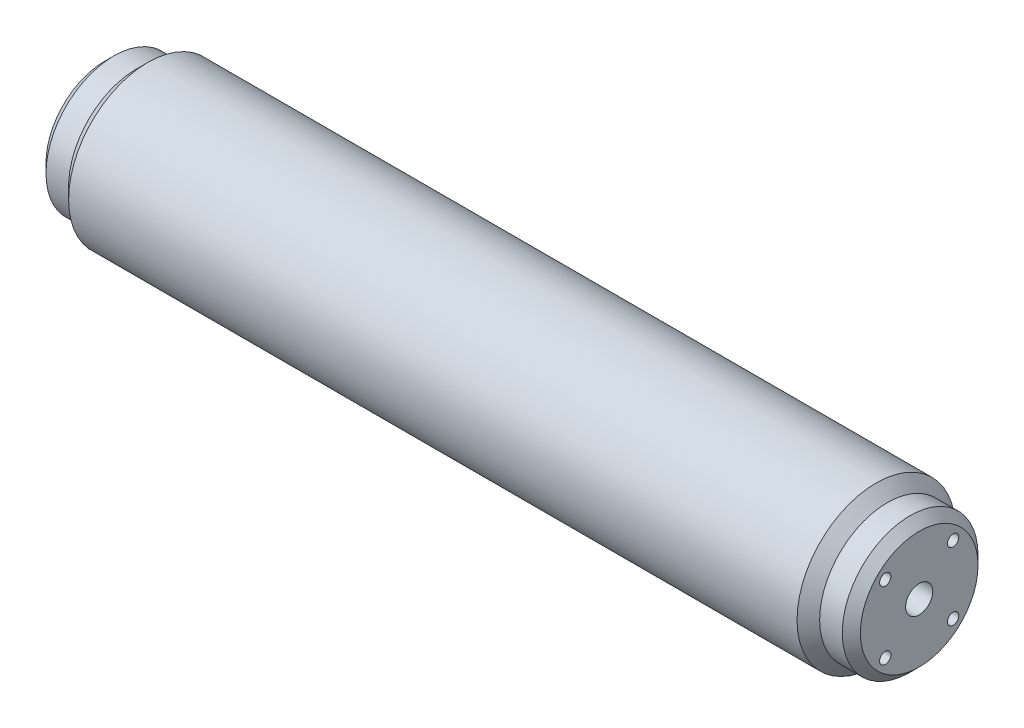
ISO-10303-21;
HEADER;
FILE_DESCRIPTION(('STEP AP214'),'2;1');
FILE_NAME('part.step','',(''),(''),'','','');
FILE_SCHEMA(('AUTOMOTIVE_DESIGN { 1 0 10303 214 1 1 1 1 }'));
ENDSEC;
DATA;
#1=APPLICATION_CONTEXT('core data for automotive mechanical design processes');
#2=APPLICATION_PROTOCOL_DEFINITION('international standard','automotive_design',2000,#1);
#3=PRODUCT_CONTEXT('',#1,'mechanical');
#4=PRODUCT('Part','Part','',(#3));
#5=PRODUCT_RELATED_PRODUCT_CATEGORY('part','',(#4));
#6=PRODUCT_DEFINITION_FORMATION('','',#4);
#7=PRODUCT_DEFINITION_CONTEXT('part definition',#1,'design');
#8=PRODUCT_DEFINITION('design','',#6,#7);
#9=PRODUCT_DEFINITION_SHAPE('','',#8);
#10=(LENGTH_UNIT() NAMED_UNIT(*) SI_UNIT(.MILLI.,.METRE.));
#11=(NAMED_UNIT(*) PLANE_ANGLE_UNIT() SI_UNIT($,.RADIAN.));
#12=(NAMED_UNIT(*) SI_UNIT($,.STERADIAN.) SOLID_ANGLE_UNIT());
#13=UNCERTAINTY_MEASURE_WITH_UNIT(LENGTH_MEASURE(1.E-05),#10,'distance_accuracy_value','');
#14=(GEOMETRIC_REPRESENTATION_CONTEXT(3) GLOBAL_UNCERTAINTY_ASSIGNED_CONTEXT((#13)) GLOBAL_UNIT_ASSIGNED_CONTEXT((#10,
#11,#12)) REPRESENTATION_CONTEXT('',''));
#15=CARTESIAN_POINT('',(0.,0.,0.));
#16=DIRECTION('',(0.,0.,1.));
#17=DIRECTION('',(1.,0.,0.));
#18=AXIS2_PLACEMENT_3D('',#15,#16,#17);
#19=CARTESIAN_POINT('',(80.,0.,0.));
#20=DIRECTION('',(-1.,0.,0.));
#21=DIRECTION('',(0.,0.,1.));
#22=AXIS2_PLACEMENT_3D('',#19,#20,#21);
#23=CYLINDRICAL_SURFACE('',#22,17.5);
#24=CARTESIAN_POINT('',(-80.5,0.,0.));
#25=DIRECTION('',(1.,0.,0.));
#26=DIRECTION('',(0.,0.,-1.));
#27=AXIS2_PLACEMENT_3D('',#24,#25,#26);
#28=CIRCLE('',#27,17.5);
#29=CARTESIAN_POINT('',(-80.5,0.,-17.5));
#30=VERTEX_POINT('',#29);
#31=EDGE_CURVE('E191',#30,#30,#28,.T.);
#32=ORIENTED_EDGE('',*,*,#31,.T.);
#33=EDGE_LOOP('',(#32));
#34=FACE_BOUND('',#33,.T.);
#35=CARTESIAN_POINT('',(80.5,0.,0.));
#36=DIRECTION('',(-1.,0.,0.));
#37=DIRECTION('',(0.,0.,1.));
#38=AXIS2_PLACEMENT_3D('',#35,#36,#37);
#39=CIRCLE('',#38,17.5);
#40=CARTESIAN_POINT('',(80.5,0.,17.5));
#41=VERTEX_POINT('',#40);
#42=EDGE_CURVE('E187',#41,#41,#39,.T.);
#43=ORIENTED_EDGE('',*,*,#42,.T.);
#44=EDGE_LOOP('',(#43));
#45=FACE_BOUND('',#44,.T.);
#46=ADVANCED_FACE('F49',(#34,#45),#23,.T.);
#47=CARTESIAN_POINT('',(-90.,0.,0.));
#48=DIRECTION('',(1.,0.,0.));
#49=DIRECTION('',(0.,0.,-1.));
#50=AXIS2_PLACEMENT_3D('',#47,#48,#49);
#51=CYLINDRICAL_SURFACE('',#50,15.);
#52=CARTESIAN_POINT('',(-88.,0.,0.));
#53=DIRECTION('',(-1.,0.,0.));
#54=DIRECTION('',(0.,0.,1.));
#55=AXIS2_PLACEMENT_3D('',#52,#53,#54);
#56=CIRCLE('',#55,15.);
#57=CARTESIAN_POINT('',(-88.,0.,15.));
#58=VERTEX_POINT('',#57);
#59=EDGE_CURVE('E11',#58,#58,#56,.F.);
#60=ORIENTED_EDGE('',*,*,#59,.T.);
#61=EDGE_LOOP('',(#60));
#62=FACE_BOUND('',#61,.T.);
#63=CARTESIAN_POINT('',(-83.0000000000001,0.,0.));
#64=DIRECTION('',(1.,0.,0.));
#65=DIRECTION('',(0.,0.,-1.));
#66=AXIS2_PLACEMENT_3D('',#63,#64,#65);
#67=CIRCLE('',#66,15.);
#68=CARTESIAN_POINT('',(-83.0000000000001,0.,-15.));
#69=VERTEX_POINT('',#68);
#70=EDGE_CURVE('E183',#69,#69,#67,.F.);
#71=ORIENTED_EDGE('',*,*,#70,.T.);
#72=EDGE_LOOP('',(#71));
#73=FACE_BOUND('',#72,.T.);
#74=ADVANCED_FACE('F222',(#62,#73),#51,.T.);
#75=CARTESIAN_POINT('',(-90.,0.,0.));
#76=DIRECTION('',(-1.,0.,0.));
#77=DIRECTION('',(0.,0.,1.));
#78=AXIS2_PLACEMENT_3D('',#75,#76,#77);
#79=PLANE('',#78);
#80=CARTESIAN_POINT('',(-90.,0.,0.));
#81=DIRECTION('',(-1.,0.,0.));
#82=DIRECTION('',(0.,0.,1.));
#83=AXIS2_PLACEMENT_3D('',#80,#81,#82);
#84=CIRCLE('',#83,3.);
#85=CARTESIAN_POINT('',(-90.,0.,3.));
#86=VERTEX_POINT('',#85);
#87=EDGE_CURVE('E139',#86,#86,#84,.T.);
#88=ORIENTED_EDGE('',*,*,#87,.F.);
#89=EDGE_LOOP('',(#88));
#90=FACE_BOUND('',#89,.T.);
#91=CARTESIAN_POINT('',(-90.,7.5,-7.5));
#92=DIRECTION('',(-1.,0.,0.));
#93=DIRECTION('',(0.,0.,1.));
#94=AXIS2_PLACEMENT_3D('',#91,#92,#93);
#95=CIRCLE('',#94,1.25);
#96=CARTESIAN_POINT('',(-90.,7.5,-6.25000000000001));
#97=VERTEX_POINT('',#96);
#98=EDGE_CURVE('E147',#97,#97,#95,.T.);
#99=ORIENTED_EDGE('',*,*,#98,.F.);
#100=EDGE_LOOP('',(#99));
#101=FACE_BOUND('',#100,.T.);
#102=CARTESIAN_POINT('',(-90.,7.5,7.5));
#103=DIRECTION('',(-1.,0.,0.));
#104=DIRECTION('',(0.,0.,1.));
#105=AXIS2_PLACEMENT_3D('',#102,#103,#104);
#106=CIRCLE('',#105,1.25);
#107=CARTESIAN_POINT('',(-90.,7.5,8.74999999999999));
#108=VERTEX_POINT('',#107);
#109=EDGE_CURVE('E155',#108,#108,#106,.T.);
#110=ORIENTED_EDGE('',*,*,#109,.F.);
#111=EDGE_LOOP('',(#110));
#112=FACE_BOUND('',#111,.T.);
#113=CARTESIAN_POINT('',(-90.,-7.5,7.5));
#114=DIRECTION('',(-1.,0.,0.));
#115=DIRECTION('',(0.,0.,1.));
#116=AXIS2_PLACEMENT_3D('',#113,#114,#115);
#117=CIRCLE('',#116,1.25);
#118=CARTESIAN_POINT('',(-90.,-7.5,8.74999999999999));
#119=VERTEX_POINT('',#118);
#120=EDGE_CURVE('E163',#119,#119,#117,.T.);
#121=ORIENTED_EDGE('',*,*,#120,.F.);
#122=EDGE_LOOP('',(#121));
#123=FACE_BOUND('',#122,.T.);
#124=CARTESIAN_POINT('',(-90.,-7.5,-7.5));
#125=DIRECTION('',(-1.,0.,0.));
#126=DIRECTION('',(0.,0.,1.));
#127=AXIS2_PLACEMENT_3D('',#124,#125,#126);
#128=CIRCLE('',#127,1.25);
#129=CARTESIAN_POINT('',(-90.,-7.5,-6.25));
#130=VERTEX_POINT('',#129);
#131=EDGE_CURVE('E171',#130,#130,#128,.T.);
#132=ORIENTED_EDGE('',*,*,#131,.F.);
#133=EDGE_LOOP('',(#132));
#134=FACE_BOUND('',#133,.T.);
#135=CARTESIAN_POINT('',(-90.,0.,0.));
#136=DIRECTION('',(-1.,0.,0.));
#137=DIRECTION('',(0.,0.,1.));
#138=AXIS2_PLACEMENT_3D('',#135,#136,#137);
#139=CIRCLE('',#138,13.);
#140=CARTESIAN_POINT('',(-90.,0.,13.));
#141=VERTEX_POINT('',#140);
#142=EDGE_CURVE('E59',#141,#141,#139,.T.);
#143=ORIENTED_EDGE('',*,*,#142,.T.);
#144=EDGE_LOOP('',(#143));
#145=FACE_BOUND('',#144,.T.);
#146=ADVANCED_FACE('F206',(#90,#101,#112,#123,#134,#145),#79,.T.);
#147=CARTESIAN_POINT('',(90.,0.,0.));
#148=DIRECTION('',(-1.,0.,0.));
#149=DIRECTION('',(0.,0.,1.));
#150=AXIS2_PLACEMENT_3D('',#147,#148,#149);
#151=CYLINDRICAL_SURFACE('',#150,15.);
#152=CARTESIAN_POINT('',(88.,0.,0.));
#153=DIRECTION('',(1.,0.,0.));
#154=DIRECTION('',(0.,0.,-1.));
#155=AXIS2_PLACEMENT_3D('',#152,#153,#154);
#156=CIRCLE('',#155,15.);
#157=CARTESIAN_POINT('',(88.,0.,-15.));
#158=VERTEX_POINT('',#157);
#159=EDGE_CURVE('E195',#158,#158,#156,.F.);
#160=ORIENTED_EDGE('',*,*,#159,.T.);
#161=EDGE_LOOP('',(#160));
#162=FACE_BOUND('',#161,.T.);
#163=CARTESIAN_POINT('',(83.,0.,0.));
#164=DIRECTION('',(1.,0.,0.));
#165=DIRECTION('',(0.,0.,-1.));
#166=AXIS2_PLACEMENT_3D('',#163,#164,#165);
#167=CIRCLE('',#166,15.);
#168=CARTESIAN_POINT('',(83.,0.,-15.));
#169=VERTEX_POINT('',#168);
#170=EDGE_CURVE('E179',#169,#169,#167,.T.);
#171=ORIENTED_EDGE('',*,*,#170,.T.);
#172=EDGE_LOOP('',(#171));
#173=FACE_BOUND('',#172,.T.);
#174=ADVANCED_FACE('F272',(#162,#173),#151,.T.);
#175=CARTESIAN_POINT('',(90.,0.,0.));
#176=DIRECTION('',(1.,0.,0.));
#177=DIRECTION('',(0.,0.,1.));
#178=AXIS2_PLACEMENT_3D('',#175,#176,#177);
#179=PLANE('',#178);
#180=CARTESIAN_POINT('',(90.,0.,0.));
#181=DIRECTION('',(1.,0.,0.));
#182=DIRECTION('',(0.,0.,-1.));
#183=AXIS2_PLACEMENT_3D('',#180,#181,#182);
#184=CIRCLE('',#183,3.);
#185=CARTESIAN_POINT('',(90.,0.,-3.));
#186=VERTEX_POINT('',#185);
#187=EDGE_CURVE('E102',#186,#186,#184,.T.);
#188=ORIENTED_EDGE('',*,*,#187,.F.);
#189=EDGE_LOOP('',(#188));
#190=FACE_BOUND('',#189,.T.);
#191=CARTESIAN_POINT('',(90.,7.5,-7.5));
#192=DIRECTION('',(1.,0.,0.));
#193=DIRECTION('',(0.,0.,-1.));
#194=AXIS2_PLACEMENT_3D('',#191,#192,#193);
#195=CIRCLE('',#194,1.25);
#196=CARTESIAN_POINT('',(90.,7.5,-8.75));
#197=VERTEX_POINT('',#196);
#198=EDGE_CURVE('E101',#197,#197,#195,.T.);
#199=ORIENTED_EDGE('',*,*,#198,.F.);
#200=EDGE_LOOP('',(#199));
#201=FACE_BOUND('',#200,.T.);
#202=CARTESIAN_POINT('',(90.,7.5,7.5));
#203=DIRECTION('',(1.,0.,0.));
#204=DIRECTION('',(0.,0.,-1.));
#205=AXIS2_PLACEMENT_3D('',#202,#203,#204);
#206=CIRCLE('',#205,1.25);
#207=CARTESIAN_POINT('',(90.,7.5,6.25));
#208=VERTEX_POINT('',#207);
#209=EDGE_CURVE('E115',#208,#208,#206,.T.);
#210=ORIENTED_EDGE('',*,*,#209,.F.);
#211=EDGE_LOOP('',(#210));
#212=FACE_BOUND('',#211,.T.);
#213=CARTESIAN_POINT('',(90.,-7.5,7.5));
#214=DIRECTION('',(1.,0.,0.));
#215=DIRECTION('',(0.,0.,-1.));
#216=AXIS2_PLACEMENT_3D('',#213,#214,#215);
#217=CIRCLE('',#216,1.25);
#218=CARTESIAN_POINT('',(90.,-7.5,6.25));
#219=VERTEX_POINT('',#218);
#220=EDGE_CURVE('E123',#219,#219,#217,.T.);
#221=ORIENTED_EDGE('',*,*,#220,.F.);
#222=EDGE_LOOP('',(#221));
#223=FACE_BOUND('',#222,.T.);
#224=CARTESIAN_POINT('',(90.,-7.5,-7.5));
#225=DIRECTION('',(1.,0.,0.));
#226=DIRECTION('',(0.,0.,-1.));
#227=AXIS2_PLACEMENT_3D('',#224,#225,#226);
#228=CIRCLE('',#227,1.25);
#229=CARTESIAN_POINT('',(90.,-7.5,-8.75));
#230=VERTEX_POINT('',#229);
#231=EDGE_CURVE('E131',#230,#230,#228,.T.);
#232=ORIENTED_EDGE('',*,*,#231,.F.);
#233=EDGE_LOOP('',(#232));
#234=FACE_BOUND('',#233,.T.);
#235=CARTESIAN_POINT('',(90.,0.,0.));
#236=DIRECTION('',(1.,0.,0.));
#237=DIRECTION('',(0.,0.,-1.));
#238=AXIS2_PLACEMENT_3D('',#235,#236,#237);
#239=CIRCLE('',#238,13.);
#240=CARTESIAN_POINT('',(90.,0.,-13.));
#241=VERTEX_POINT('',#240);
#242=EDGE_CURVE('E199',#241,#241,#239,.T.);
#243=ORIENTED_EDGE('',*,*,#242,.T.);
#244=EDGE_LOOP('',(#243));
#245=FACE_BOUND('',#244,.T.);
#246=ADVANCED_FACE('F240',(#190,#201,#212,#223,#234,#245),#179,.T.);
#247=CARTESIAN_POINT('',(80.,0.,0.));
#248=DIRECTION('',(-1.,0.,0.));
#249=DIRECTION('',(0.,0.,1.));
#250=AXIS2_PLACEMENT_3D('',#247,#248,#249);
#251=CONICAL_SURFACE('',#250,18.,0.785398163397454);
#252=ORIENTED_EDGE('',*,*,#170,.F.);
#253=EDGE_LOOP('',(#252));
#254=FACE_BOUND('',#253,.T.);
#255=ORIENTED_EDGE('',*,*,#42,.F.);
#256=EDGE_LOOP('',(#255));
#257=FACE_BOUND('',#256,.T.);
#258=ADVANCED_FACE('F234',(#254,#257),#251,.T.);
#259=CARTESIAN_POINT('',(-83.0000000000001,0.,0.));
#260=DIRECTION('',(1.,0.,0.));
#261=DIRECTION('',(0.,0.,-1.));
#262=AXIS2_PLACEMENT_3D('',#259,#260,#261);
#263=CONICAL_SURFACE('',#262,15.,0.785398163397442);
#264=ORIENTED_EDGE('',*,*,#31,.F.);
#265=EDGE_LOOP('',(#264));
#266=FACE_BOUND('',#265,.T.);
#267=ORIENTED_EDGE('',*,*,#70,.F.);
#268=EDGE_LOOP('',(#267));
#269=FACE_BOUND('',#268,.T.);
#270=ADVANCED_FACE('F218',(#266,#269),#263,.T.);
#271=CARTESIAN_POINT('',(88.,0.,0.));
#272=DIRECTION('',(-1.,0.,0.));
#273=DIRECTION('',(0.,0.,1.));
#274=AXIS2_PLACEMENT_3D('',#271,#272,#273);
#275=CONICAL_SURFACE('',#274,15.,0.785398163397448);
#276=ORIENTED_EDGE('',*,*,#242,.F.);
#277=EDGE_LOOP('',(#276));
#278=FACE_BOUND('',#277,.T.);
#279=ORIENTED_EDGE('',*,*,#159,.F.);
#280=EDGE_LOOP('',(#279));
#281=FACE_BOUND('',#280,.T.);
#282=ADVANCED_FACE('F210',(#278,#281),#275,.T.);
#283=CARTESIAN_POINT('',(-90.,0.,0.));
#284=DIRECTION('',(1.,0.,0.));
#285=DIRECTION('',(0.,0.,-1.));
#286=AXIS2_PLACEMENT_3D('',#283,#284,#285);
#287=CONICAL_SURFACE('',#286,13.,0.785398163397449);
#288=ORIENTED_EDGE('',*,*,#59,.F.);
#289=EDGE_LOOP('',(#288));
#290=FACE_BOUND('',#289,.T.);
#291=ORIENTED_EDGE('',*,*,#142,.F.);
#292=EDGE_LOOP('',(#291));
#293=FACE_BOUND('',#292,.T.);
#294=ADVANCED_FACE('F52',(#290,#293),#287,.T.);
#295=CARTESIAN_POINT('',(-81.5,-7.5,-7.5));
#296=DIRECTION('',(-1.,0.,0.));
#297=DIRECTION('',(0.,0.,1.));
#298=AXIS2_PLACEMENT_3D('',#295,#296,#297);
#299=CONICAL_SURFACE('',#298,1.25,1.02974425867666);
#300=CARTESIAN_POINT('',(-80.7489242262155,-7.5,-7.5));
#301=VERTEX_POINT('',#300);
#302=VERTEX_LOOP('',#301);
#303=FACE_BOUND('',#302,.T.);
#304=CARTESIAN_POINT('',(-81.5,-7.5,-7.5));
#305=DIRECTION('',(-1.,0.,0.));
#306=DIRECTION('',(0.,0.,1.));
#307=AXIS2_PLACEMENT_3D('',#304,#305,#306);
#308=CIRCLE('',#307,1.25);
#309=CARTESIAN_POINT('',(-81.5,-7.5,-6.25000000000001));
#310=VERTEX_POINT('',#309);
#311=EDGE_CURVE('E175',#310,#310,#308,.T.);
#312=ORIENTED_EDGE('',*,*,#311,.T.);
#313=EDGE_LOOP('',(#312));
#314=FACE_BOUND('',#313,.T.);
#315=ADVANCED_FACE('F209',(#303,#314),#299,.F.);
#316=CARTESIAN_POINT('',(-90.,-7.5,-7.5));
#317=DIRECTION('',(-1.,0.,0.));
#318=DIRECTION('',(0.,0.,1.));
#319=AXIS2_PLACEMENT_3D('',#316,#317,#318);
#320=CYLINDRICAL_SURFACE('',#319,1.25);
#321=ORIENTED_EDGE('',*,*,#311,.F.);
#322=EDGE_LOOP('',(#321));
#323=FACE_BOUND('',#322,.T.);
#324=ORIENTED_EDGE('',*,*,#131,.T.);
#325=EDGE_LOOP('',(#324));
#326=FACE_BOUND('',#325,.T.);
#327=ADVANCED_FACE('F216',(#323,#326),#320,.F.);
#328=CARTESIAN_POINT('',(-81.5,-7.5,7.5));
#329=DIRECTION('',(-1.,0.,0.));
#330=DIRECTION('',(0.,0.,1.));
#331=AXIS2_PLACEMENT_3D('',#328,#329,#330);
#332=CONICAL_SURFACE('',#331,1.25,1.02974425867666);
#333=CARTESIAN_POINT('',(-80.7489242262155,-7.5,7.5));
#334=VERTEX_POINT('',#333);
#335=VERTEX_LOOP('',#334);
#336=FACE_BOUND('',#335,.T.);
#337=CARTESIAN_POINT('',(-81.5,-7.5,7.5));
#338=DIRECTION('',(-1.,0.,0.));
#339=DIRECTION('',(0.,0.,1.));
#340=AXIS2_PLACEMENT_3D('',#337,#338,#339);
#341=CIRCLE('',#340,1.25);
#342=CARTESIAN_POINT('',(-81.5,-7.5,8.74999999999999));
#343=VERTEX_POINT('',#342);
#344=EDGE_CURVE('E167',#343,#343,#341,.T.);
#345=ORIENTED_EDGE('',*,*,#344,.T.);
#346=EDGE_LOOP('',(#345));
#347=FACE_BOUND('',#346,.T.);
#348=ADVANCED_FACE('F293',(#336,#347),#332,.F.);
#349=CARTESIAN_POINT('',(-90.,-7.5,7.5));
#350=DIRECTION('',(-1.,0.,0.));
#351=DIRECTION('',(0.,0.,1.));
#352=AXIS2_PLACEMENT_3D('',#349,#350,#351);
#353=CYLINDRICAL_SURFACE('',#352,1.25);
#354=ORIENTED_EDGE('',*,*,#344,.F.);
#355=EDGE_LOOP('',(#354));
#356=FACE_BOUND('',#355,.T.);
#357=ORIENTED_EDGE('',*,*,#120,.T.);
#358=EDGE_LOOP('',(#357));
#359=FACE_BOUND('',#358,.T.);
#360=ADVANCED_FACE('F306',(#356,#359),#353,.F.);
#361=CARTESIAN_POINT('',(-81.5,7.5,7.5));
#362=DIRECTION('',(-1.,0.,0.));
#363=DIRECTION('',(0.,0.,1.));
#364=AXIS2_PLACEMENT_3D('',#361,#362,#363);
#365=CONICAL_SURFACE('',#364,1.25,1.02974425867666);
#366=CARTESIAN_POINT('',(-80.7489242262155,7.5,7.5));
#367=VERTEX_POINT('',#366);
#368=VERTEX_LOOP('',#367);
#369=FACE_BOUND('',#368,.T.);
#370=CARTESIAN_POINT('',(-81.5,7.5,7.5));
#371=DIRECTION('',(-1.,0.,0.));
#372=DIRECTION('',(0.,0.,1.));
#373=AXIS2_PLACEMENT_3D('',#370,#371,#372);
#374=CIRCLE('',#373,1.25);
#375=CARTESIAN_POINT('',(-81.5,7.5,8.74999999999999));
#376=VERTEX_POINT('',#375);
#377=EDGE_CURVE('E159',#376,#376,#374,.T.);
#378=ORIENTED_EDGE('',*,*,#377,.T.);
#379=EDGE_LOOP('',(#378));
#380=FACE_BOUND('',#379,.T.);
#381=ADVANCED_FACE('F316',(#369,#380),#365,.F.);
#382=CARTESIAN_POINT('',(-90.,7.5,7.5));
#383=DIRECTION('',(-1.,0.,0.));
#384=DIRECTION('',(0.,0.,1.));
#385=AXIS2_PLACEMENT_3D('',#382,#383,#384);
#386=CYLINDRICAL_SURFACE('',#385,1.25);
#387=ORIENTED_EDGE('',*,*,#377,.F.);
#388=EDGE_LOOP('',(#387));
#389=FACE_BOUND('',#388,.T.);
#390=ORIENTED_EDGE('',*,*,#109,.T.);
#391=EDGE_LOOP('',(#390));
#392=FACE_BOUND('',#391,.T.);
#393=ADVANCED_FACE('F329',(#389,#392),#386,.F.);
#394=CARTESIAN_POINT('',(-81.5,7.5,-7.5));
#395=DIRECTION('',(-1.,0.,0.));
#396=DIRECTION('',(0.,0.,1.));
#397=AXIS2_PLACEMENT_3D('',#394,#395,#396);
#398=CONICAL_SURFACE('',#397,1.25,1.02974425867666);
#399=CARTESIAN_POINT('',(-80.7489242262155,7.5,-7.5));
#400=VERTEX_POINT('',#399);
#401=VERTEX_LOOP('',#400);
#402=FACE_BOUND('',#401,.T.);
#403=CARTESIAN_POINT('',(-81.5,7.5,-7.5));
#404=DIRECTION('',(-1.,0.,0.));
#405=DIRECTION('',(0.,0.,1.));
#406=AXIS2_PLACEMENT_3D('',#403,#404,#405);
#407=CIRCLE('',#406,1.25);
#408=CARTESIAN_POINT('',(-81.5,7.5,-6.25000000000001));
#409=VERTEX_POINT('',#408);
#410=EDGE_CURVE('E151',#409,#409,#407,.T.);
#411=ORIENTED_EDGE('',*,*,#410,.T.);
#412=EDGE_LOOP('',(#411));
#413=FACE_BOUND('',#412,.T.);
#414=ADVANCED_FACE('F340',(#402,#413),#398,.F.);
#415=CARTESIAN_POINT('',(-90.,7.5,-7.5));
#416=DIRECTION('',(-1.,0.,0.));
#417=DIRECTION('',(0.,0.,1.));
#418=AXIS2_PLACEMENT_3D('',#415,#416,#417);
#419=CYLINDRICAL_SURFACE('',#418,1.25);
#420=ORIENTED_EDGE('',*,*,#410,.F.);
#421=EDGE_LOOP('',(#420));
#422=FACE_BOUND('',#421,.T.);
#423=ORIENTED_EDGE('',*,*,#98,.T.);
#424=EDGE_LOOP('',(#423));
#425=FACE_BOUND('',#424,.T.);
#426=ADVANCED_FACE('F353',(#422,#425),#419,.F.);
#427=CARTESIAN_POINT('',(-81.5,0.,0.));
#428=DIRECTION('',(-1.,0.,0.));
#429=DIRECTION('',(0.,0.,1.));
#430=AXIS2_PLACEMENT_3D('',#427,#428,#429);
#431=CONICAL_SURFACE('',#430,3.,1.02974425867665);
#432=CARTESIAN_POINT('',(-79.6974181429173,0.,0.));
#433=VERTEX_POINT('',#432);
#434=VERTEX_LOOP('',#433);
#435=FACE_BOUND('',#434,.T.);
#436=CARTESIAN_POINT('',(-81.5,0.,0.));
#437=DIRECTION('',(-1.,0.,0.));
#438=DIRECTION('',(0.,0.,1.));
#439=AXIS2_PLACEMENT_3D('',#436,#437,#438);
#440=CIRCLE('',#439,3.);
#441=CARTESIAN_POINT('',(-81.5,0.,3.));
#442=VERTEX_POINT('',#441);
#443=EDGE_CURVE('E143',#442,#442,#440,.T.);
#444=ORIENTED_EDGE('',*,*,#443,.T.);
#445=EDGE_LOOP('',(#444));
#446=FACE_BOUND('',#445,.T.);
#447=ADVANCED_FACE('F364',(#435,#446),#431,.F.);
#448=CARTESIAN_POINT('',(-90.,0.,0.));
#449=DIRECTION('',(-1.,0.,0.));
#450=DIRECTION('',(0.,0.,1.));
#451=AXIS2_PLACEMENT_3D('',#448,#449,#450);
#452=CYLINDRICAL_SURFACE('',#451,3.);
#453=ORIENTED_EDGE('',*,*,#443,.F.);
#454=EDGE_LOOP('',(#453));
#455=FACE_BOUND('',#454,.T.);
#456=ORIENTED_EDGE('',*,*,#87,.T.);
#457=EDGE_LOOP('',(#456));
#458=FACE_BOUND('',#457,.T.);
#459=ADVANCED_FACE('F386',(#455,#458),#452,.F.);
#460=CARTESIAN_POINT('',(81.5,-7.5,-7.5));
#461=DIRECTION('',(1.,0.,0.));
#462=DIRECTION('',(0.,0.,-1.));
#463=AXIS2_PLACEMENT_3D('',#460,#461,#462);
#464=CONICAL_SURFACE('',#463,1.25,1.02974425867666);
#465=CARTESIAN_POINT('',(80.7489242262155,-7.5,-7.5));
#466=VERTEX_POINT('',#465);
#467=VERTEX_LOOP('',#466);
#468=FACE_BOUND('',#467,.T.);
#469=CARTESIAN_POINT('',(81.5,-7.5,-7.5));
#470=DIRECTION('',(1.,0.,0.));
#471=DIRECTION('',(0.,0.,-1.));
#472=AXIS2_PLACEMENT_3D('',#469,#470,#471);
#473=CIRCLE('',#472,1.25);
#474=CARTESIAN_POINT('',(81.5,-7.5,-8.75));
#475=VERTEX_POINT('',#474);
#476=EDGE_CURVE('E135',#475,#475,#473,.T.);
#477=ORIENTED_EDGE('',*,*,#476,.T.);
#478=EDGE_LOOP('',(#477));
#479=FACE_BOUND('',#478,.T.);
#480=ADVANCED_FACE('F397',(#468,#479),#464,.F.);
#481=CARTESIAN_POINT('',(90.,-7.5,-7.5));
#482=DIRECTION('',(1.,0.,0.));
#483=DIRECTION('',(0.,0.,-1.));
#484=AXIS2_PLACEMENT_3D('',#481,#482,#483);
#485=CYLINDRICAL_SURFACE('',#484,1.25);
#486=ORIENTED_EDGE('',*,*,#476,.F.);
#487=EDGE_LOOP('',(#486));
#488=FACE_BOUND('',#487,.T.);
#489=ORIENTED_EDGE('',*,*,#231,.T.);
#490=EDGE_LOOP('',(#489));
#491=FACE_BOUND('',#490,.T.);
#492=ADVANCED_FACE('F420',(#488,#491),#485,.F.);
#493=CARTESIAN_POINT('',(81.5,-7.5,7.5));
#494=DIRECTION('',(1.,0.,0.));
#495=DIRECTION('',(0.,0.,-1.));
#496=AXIS2_PLACEMENT_3D('',#493,#494,#495);
#497=CONICAL_SURFACE('',#496,1.25,1.02974425867666);
#498=CARTESIAN_POINT('',(80.7489242262155,-7.5,7.5));
#499=VERTEX_POINT('',#498);
#500=VERTEX_LOOP('',#499);
#501=FACE_BOUND('',#500,.T.);
#502=CARTESIAN_POINT('',(81.5,-7.5,7.5));
#503=DIRECTION('',(1.,0.,0.));
#504=DIRECTION('',(0.,0.,-1.));
#505=AXIS2_PLACEMENT_3D('',#502,#503,#504);
#506=CIRCLE('',#505,1.25);
#507=CARTESIAN_POINT('',(81.5,-7.5,6.25));
#508=VERTEX_POINT('',#507);
#509=EDGE_CURVE('E127',#508,#508,#506,.T.);
#510=ORIENTED_EDGE('',*,*,#509,.T.);
#511=EDGE_LOOP('',(#510));
#512=FACE_BOUND('',#511,.T.);
#513=ADVANCED_FACE('F432',(#501,#512),#497,.F.);
#514=CARTESIAN_POINT('',(90.,-7.5,7.5));
#515=DIRECTION('',(1.,0.,0.));
#516=DIRECTION('',(0.,0.,-1.));
#517=AXIS2_PLACEMENT_3D('',#514,#515,#516);
#518=CYLINDRICAL_SURFACE('',#517,1.25);
#519=ORIENTED_EDGE('',*,*,#509,.F.);
#520=EDGE_LOOP('',(#519));
#521=FACE_BOUND('',#520,.T.);
#522=ORIENTED_EDGE('',*,*,#220,.T.);
#523=EDGE_LOOP('',(#522));
#524=FACE_BOUND('',#523,.T.);
#525=ADVANCED_FACE('F445',(#521,#524),#518,.F.);
#526=CARTESIAN_POINT('',(81.5,7.5,7.5));
#527=DIRECTION('',(1.,0.,0.));
#528=DIRECTION('',(0.,0.,-1.));
#529=AXIS2_PLACEMENT_3D('',#526,#527,#528);
#530=CONICAL_SURFACE('',#529,1.25,1.02974425867666);
#531=CARTESIAN_POINT('',(80.7489242262155,7.5,7.5));
#532=VERTEX_POINT('',#531);
#533=VERTEX_LOOP('',#532);
#534=FACE_BOUND('',#533,.T.);
#535=CARTESIAN_POINT('',(81.5,7.5,7.5));
#536=DIRECTION('',(1.,0.,0.));
#537=DIRECTION('',(0.,0.,-1.));
#538=AXIS2_PLACEMENT_3D('',#535,#536,#537);
#539=CIRCLE('',#538,1.25);
#540=CARTESIAN_POINT('',(81.5,7.5,6.25));
#541=VERTEX_POINT('',#540);
#542=EDGE_CURVE('E119',#541,#541,#539,.T.);
#543=ORIENTED_EDGE('',*,*,#542,.T.);
#544=EDGE_LOOP('',(#543));
#545=FACE_BOUND('',#544,.T.);
#546=ADVANCED_FACE('F456',(#534,#545),#530,.F.);
#547=CARTESIAN_POINT('',(90.,7.5,7.5));
#548=DIRECTION('',(1.,0.,0.));
#549=DIRECTION('',(0.,0.,-1.));
#550=AXIS2_PLACEMENT_3D('',#547,#548,#549);
#551=CYLINDRICAL_SURFACE('',#550,1.25);
#552=ORIENTED_EDGE('',*,*,#542,.F.);
#553=EDGE_LOOP('',(#552));
#554=FACE_BOUND('',#553,.T.);
#555=ORIENTED_EDGE('',*,*,#209,.T.);
#556=EDGE_LOOP('',(#555));
#557=FACE_BOUND('',#556,.T.);
#558=ADVANCED_FACE('F468',(#554,#557),#551,.F.);
#559=CARTESIAN_POINT('',(81.5,7.5,-7.5));
#560=DIRECTION('',(1.,0.,0.));
#561=DIRECTION('',(0.,0.,-1.));
#562=AXIS2_PLACEMENT_3D('',#559,#560,#561);
#563=CONICAL_SURFACE('',#562,1.25,1.02974425867666);
#564=CARTESIAN_POINT('',(80.7489242262155,7.5,-7.5));
#565=VERTEX_POINT('',#564);
#566=VERTEX_LOOP('',#565);
#567=FACE_BOUND('',#566,.T.);
#568=CARTESIAN_POINT('',(81.5,7.5,-7.5));
#569=DIRECTION('',(1.,0.,0.));
#570=DIRECTION('',(0.,0.,-1.));
#571=AXIS2_PLACEMENT_3D('',#568,#569,#570);
#572=CIRCLE('',#571,1.25);
#573=CARTESIAN_POINT('',(81.5,7.5,-8.75));
#574=VERTEX_POINT('',#573);
#575=EDGE_CURVE('E107',#574,#574,#572,.T.);
#576=ORIENTED_EDGE('',*,*,#575,.T.);
#577=EDGE_LOOP('',(#576));
#578=FACE_BOUND('',#577,.T.);
#579=ADVANCED_FACE('F480',(#567,#578),#563,.F.);
#580=CARTESIAN_POINT('',(90.,7.5,-7.5));
#581=DIRECTION('',(1.,0.,0.));
#582=DIRECTION('',(0.,0.,-1.));
#583=AXIS2_PLACEMENT_3D('',#580,#581,#582);
#584=CYLINDRICAL_SURFACE('',#583,1.25);
#585=ORIENTED_EDGE('',*,*,#575,.F.);
#586=EDGE_LOOP('',(#585));
#587=FACE_BOUND('',#586,.T.);
#588=ORIENTED_EDGE('',*,*,#198,.T.);
#589=EDGE_LOOP('',(#588));
#590=FACE_BOUND('',#589,.T.);
#591=ADVANCED_FACE('F94',(#587,#590),#584,.F.);
#592=CARTESIAN_POINT('',(81.5,0.,0.));
#593=DIRECTION('',(1.,0.,0.));
#594=DIRECTION('',(0.,0.,-1.));
#595=AXIS2_PLACEMENT_3D('',#592,#593,#594);
#596=CONICAL_SURFACE('',#595,3.,1.02974425867665);
#597=CARTESIAN_POINT('',(79.6974181429173,0.,0.));
#598=VERTEX_POINT('',#597);
#599=VERTEX_LOOP('',#598);
#600=FACE_BOUND('',#599,.T.);
#601=CARTESIAN_POINT('',(81.5,0.,0.));
#602=DIRECTION('',(1.,0.,0.));
#603=DIRECTION('',(0.,0.,-1.));
#604=AXIS2_PLACEMENT_3D('',#601,#602,#603);
#605=CIRCLE('',#604,3.);
#606=CARTESIAN_POINT('',(81.5,0.,-3.));
#607=VERTEX_POINT('',#606);
#608=EDGE_CURVE('E98',#607,#607,#605,.T.);
#609=ORIENTED_EDGE('',*,*,#608,.T.);
#610=EDGE_LOOP('',(#609));
#611=FACE_BOUND('',#610,.T.);
#612=ADVANCED_FACE('F90',(#600,#611),#596,.F.);
#613=CARTESIAN_POINT('',(90.,0.,0.));
#614=DIRECTION('',(1.,0.,0.));
#615=DIRECTION('',(0.,0.,-1.));
#616=AXIS2_PLACEMENT_3D('',#613,#614,#615);
#617=CYLINDRICAL_SURFACE('',#616,3.);
#618=ORIENTED_EDGE('',*,*,#608,.F.);
#619=EDGE_LOOP('',(#618));
#620=FACE_BOUND('',#619,.T.);
#621=ORIENTED_EDGE('',*,*,#187,.T.);
#622=EDGE_LOOP('',(#621));
#623=FACE_BOUND('',#622,.T.);
#624=ADVANCED_FACE('F93',(#620,#623),#617,.F.);
#625=CLOSED_SHELL('',(#46,#74,#146,#174,#246,#258,#270,#282,#294,#315,#327,#348,#360,#381,#393,
#414,#426,#447,#459,#480,#492,#513,#525,#546,#558,#579,#591,#612,#624));
#626=MANIFOLD_SOLID_BREP('B2',#625);
#627=ADVANCED_BREP_SHAPE_REPRESENTATION('',(#18,#626),#14);
#628=SHAPE_DEFINITION_REPRESENTATION(#9,#627);
ENDSEC;
END-ISO-10303-21;
